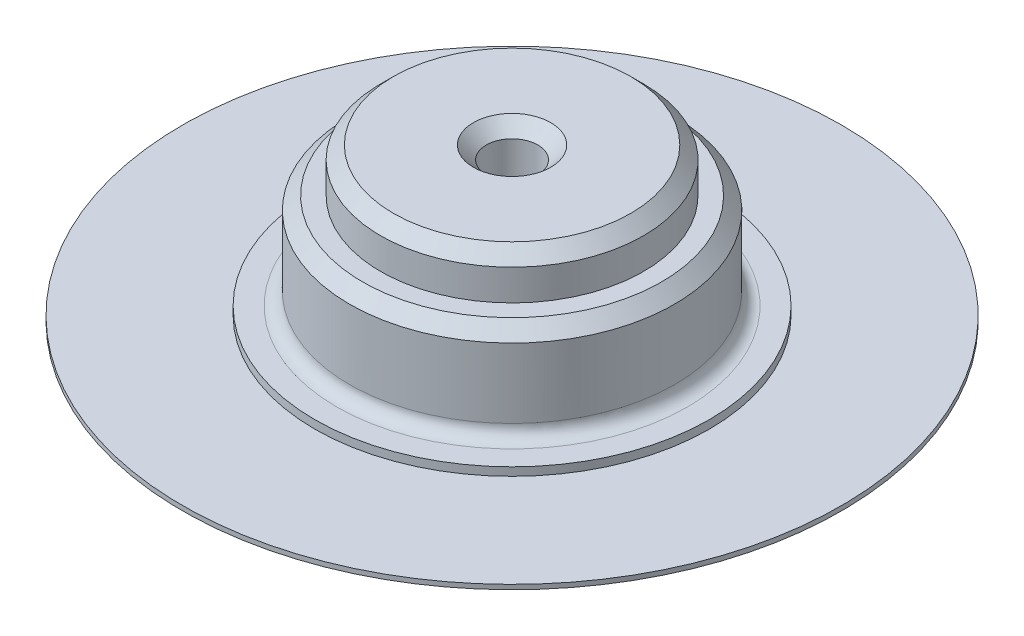
ISO-10303-21;
HEADER;
FILE_DESCRIPTION(('STEP AP214'),'2;1');
FILE_NAME('part.step','',(''),(''),'','','');
FILE_SCHEMA(('AUTOMOTIVE_DESIGN { 1 0 10303 214 1 1 1 1 }'));
ENDSEC;
DATA;
#1=APPLICATION_CONTEXT('core data for automotive mechanical design processes');
#2=APPLICATION_PROTOCOL_DEFINITION('international standard','automotive_design',2000,#1);
#3=PRODUCT_CONTEXT('',#1,'mechanical');
#4=PRODUCT('Part','Part','',(#3));
#5=PRODUCT_RELATED_PRODUCT_CATEGORY('part','',(#4));
#6=PRODUCT_DEFINITION_FORMATION('','',#4);
#7=PRODUCT_DEFINITION_CONTEXT('part definition',#1,'design');
#8=PRODUCT_DEFINITION('design','',#6,#7);
#9=PRODUCT_DEFINITION_SHAPE('','',#8);
#10=(LENGTH_UNIT() NAMED_UNIT(*) SI_UNIT(.MILLI.,.METRE.));
#11=(NAMED_UNIT(*) PLANE_ANGLE_UNIT() SI_UNIT($,.RADIAN.));
#12=(NAMED_UNIT(*) SI_UNIT($,.STERADIAN.) SOLID_ANGLE_UNIT());
#13=UNCERTAINTY_MEASURE_WITH_UNIT(LENGTH_MEASURE(1.E-05),#10,'distance_accuracy_value','');
#14=(GEOMETRIC_REPRESENTATION_CONTEXT(3) GLOBAL_UNCERTAINTY_ASSIGNED_CONTEXT((#13)) GLOBAL_UNIT_ASSIGNED_CONTEXT((#10,
#11,#12)) REPRESENTATION_CONTEXT('',''));
#15=CARTESIAN_POINT('',(0.,0.,0.));
#16=DIRECTION('',(0.,0.,1.));
#17=DIRECTION('',(1.,0.,0.));
#18=AXIS2_PLACEMENT_3D('',#15,#16,#17);
#19=CARTESIAN_POINT('',(0.,3.70000000003756,0.));
#20=DIRECTION('',(0.,-1.,0.));
#21=DIRECTION('',(0.,0.,-1.));
#22=AXIS2_PLACEMENT_3D('',#19,#20,#21);
#23=CONICAL_SURFACE('',#22,6.30000000006703,0.785398163454292);
#24=CARTESIAN_POINT('',(0.,3.7,0.));
#25=DIRECTION('',(0.,-1.,0.));
#26=DIRECTION('',(0.,0.,-1.));
#27=AXIS2_PLACEMENT_3D('',#24,#25,#26);
#28=CIRCLE('',#27,6.3);
#29=CARTESIAN_POINT('',(0.,3.7,-6.3));
#30=VERTEX_POINT('',#29);
#31=EDGE_CURVE('E91',#30,#30,#28,.T.);
#32=ORIENTED_EDGE('',*,*,#31,.F.);
#33=EDGE_LOOP('',(#32));
#34=FACE_BOUND('',#33,.T.);
#35=CARTESIAN_POINT('',(0.,4.20000000002574,0.));
#36=DIRECTION('',(0.,-1.,0.));
#37=DIRECTION('',(0.,0.,-1.));
#38=AXIS2_PLACEMENT_3D('',#35,#36,#37);
#39=CIRCLE('',#38,5.80000000002201);
#40=CARTESIAN_POINT('',(0.,4.20000000002574,-5.80000000002201));
#41=VERTEX_POINT('',#40);
#42=EDGE_CURVE('E90',#41,#41,#39,.F.);
#43=ORIENTED_EDGE('',*,*,#42,.F.);
#44=EDGE_LOOP('',(#43));
#45=FACE_BOUND('',#44,.T.);
#46=ADVANCED_FACE('F17',(#34,#45),#23,.T.);
#47=CARTESIAN_POINT('',(0.,0.,0.));
#48=DIRECTION('',(0.,-1.,0.));
#49=DIRECTION('',(0.,0.,-1.));
#50=AXIS2_PLACEMENT_3D('',#47,#48,#49);
#51=CYLINDRICAL_SURFACE('',#50,6.3);
#52=CARTESIAN_POINT('',(0.,1.,0.));
#53=DIRECTION('',(0.,-1.,0.));
#54=DIRECTION('',(1.,0.,0.));
#55=AXIS2_PLACEMENT_3D('',#52,#53,#54);
#56=CIRCLE('',#55,6.3);
#57=CARTESIAN_POINT('',(6.3,1.,0.));
#58=VERTEX_POINT('',#57);
#59=EDGE_CURVE('E82',#58,#58,#56,.F.);
#60=ORIENTED_EDGE('',*,*,#59,.T.);
#61=EDGE_LOOP('',(#60));
#62=FACE_BOUND('',#61,.T.);
#63=ORIENTED_EDGE('',*,*,#31,.T.);
#64=EDGE_LOOP('',(#63));
#65=FACE_BOUND('',#64,.T.);
#66=ADVANCED_FACE('F118',(#62,#65),#51,.T.);
#67=CARTESIAN_POINT('',(-5.8,4.2,0.));
#68=DIRECTION('',(0.,1.,0.));
#69=DIRECTION('',(0.,0.,1.));
#70=AXIS2_PLACEMENT_3D('',#67,#68,#69);
#71=PLANE('',#70);
#72=CARTESIAN_POINT('',(0.,4.2,0.));
#73=DIRECTION('',(0.,-1.,0.));
#74=DIRECTION('',(0.,0.,-1.));
#75=AXIS2_PLACEMENT_3D('',#72,#73,#74);
#76=CIRCLE('',#75,5.1);
#77=CARTESIAN_POINT('',(0.,4.2,-5.1));
#78=VERTEX_POINT('',#77);
#79=EDGE_CURVE('E41',#78,#78,#76,.F.);
#80=ORIENTED_EDGE('',*,*,#79,.F.);
#81=EDGE_LOOP('',(#80));
#82=FACE_BOUND('',#81,.T.);
#83=ORIENTED_EDGE('',*,*,#42,.T.);
#84=EDGE_LOOP('',(#83));
#85=FACE_BOUND('',#84,.T.);
#86=ADVANCED_FACE('F74',(#82,#85),#71,.T.);
#87=CARTESIAN_POINT('',(0.,1.,0.));
#88=DIRECTION('',(0.,-1.,0.));
#89=DIRECTION('',(1.,0.,0.));
#90=AXIS2_PLACEMENT_3D('',#87,#88,#89);
#91=TOROIDAL_SURFACE('',#90,6.8,0.5);
#92=ORIENTED_EDGE('',*,*,#59,.F.);
#93=EDGE_LOOP('',(#92));
#94=FACE_BOUND('',#93,.T.);
#95=CARTESIAN_POINT('',(0.,0.5,0.));
#96=DIRECTION('',(0.,1.,0.));
#97=DIRECTION('',(-1.,0.,0.));
#98=AXIS2_PLACEMENT_3D('',#95,#96,#97);
#99=CIRCLE('',#98,6.8);
#100=CARTESIAN_POINT('',(6.8,0.5,0.));
#101=VERTEX_POINT('',#100);
#102=CARTESIAN_POINT('',(-6.8,0.5,0.));
#103=VERTEX_POINT('',#102);
#104=EDGE_CURVE('E34',#101,#103,#99,.F.);
#105=ORIENTED_EDGE('',*,*,#104,.F.);
#106=CARTESIAN_POINT('',(0.,0.5,0.));
#107=DIRECTION('',(0.,1.,0.));
#108=DIRECTION('',(1.,0.,0.));
#109=AXIS2_PLACEMENT_3D('',#106,#107,#108);
#110=CIRCLE('',#109,6.8);
#111=EDGE_CURVE('E37',#103,#101,#110,.F.);
#112=ORIENTED_EDGE('',*,*,#111,.F.);
#113=EDGE_LOOP('',(#105,#112));
#114=FACE_BOUND('',#113,.T.);
#115=ADVANCED_FACE('F38',(#94,#114),#91,.F.);
#116=CARTESIAN_POINT('',(0.,0.,0.));
#117=DIRECTION('',(0.,-1.,0.));
#118=DIRECTION('',(0.,0.,-1.));
#119=AXIS2_PLACEMENT_3D('',#116,#117,#118);
#120=CYLINDRICAL_SURFACE('',#119,5.1);
#121=ORIENTED_EDGE('',*,*,#79,.T.);
#122=EDGE_LOOP('',(#121));
#123=FACE_BOUND('',#122,.T.);
#124=CARTESIAN_POINT('',(0.,5.40000000000873,0.));
#125=DIRECTION('',(0.,-1.,0.));
#126=DIRECTION('',(1.,0.,0.));
#127=AXIS2_PLACEMENT_3D('',#124,#125,#126);
#128=CIRCLE('',#127,5.10000000002719);
#129=CARTESIAN_POINT('',(5.10000000002719,5.40000000000873,0.));
#130=VERTEX_POINT('',#129);
#131=EDGE_CURVE('E46',#130,#130,#128,.F.);
#132=ORIENTED_EDGE('',*,*,#131,.F.);
#133=EDGE_LOOP('',(#132));
#134=FACE_BOUND('',#133,.T.);
#135=ADVANCED_FACE('F66',(#123,#134),#120,.T.);
#136=CARTESIAN_POINT('',(-7.65,0.5,0.));
#137=DIRECTION('',(0.,1.,0.));
#138=DIRECTION('',(0.,0.,1.));
#139=AXIS2_PLACEMENT_3D('',#136,#137,#138);
#140=PLANE('',#139);
#141=ORIENTED_EDGE('',*,*,#111,.T.);
#142=ORIENTED_EDGE('',*,*,#104,.T.);
#143=EDGE_LOOP('',(#141,#142));
#144=FACE_BOUND('',#143,.T.);
#145=CARTESIAN_POINT('',(0.,0.5,0.));
#146=DIRECTION('',(0.,-1.,0.));
#147=DIRECTION('',(0.,0.,-1.));
#148=AXIS2_PLACEMENT_3D('',#145,#146,#147);
#149=CIRCLE('',#148,7.65);
#150=CARTESIAN_POINT('',(0.,0.5,-7.65));
#151=VERTEX_POINT('',#150);
#152=EDGE_CURVE('E109',#151,#151,#149,.T.);
#153=ORIENTED_EDGE('',*,*,#152,.F.);
#154=EDGE_LOOP('',(#153));
#155=FACE_BOUND('',#154,.T.);
#156=ADVANCED_FACE('F44',(#144,#155),#140,.T.);
#157=CARTESIAN_POINT('',(0.,5.40000000000873,0.));
#158=DIRECTION('',(0.,-1.,0.));
#159=DIRECTION('',(0.,0.,-1.));
#160=AXIS2_PLACEMENT_3D('',#157,#158,#159);
#161=CONICAL_SURFACE('',#160,5.10000000002719,0.785398163454292);
#162=ORIENTED_EDGE('',*,*,#131,.T.);
#163=EDGE_LOOP('',(#162));
#164=FACE_BOUND('',#163,.T.);
#165=CARTESIAN_POINT('',(0.,5.89999999999691,0.));
#166=DIRECTION('',(0.,-1.,0.));
#167=DIRECTION('',(0.,0.,-1.));
#168=AXIS2_PLACEMENT_3D('',#165,#166,#167);
#169=CIRCLE('',#168,4.59999999998217);
#170=CARTESIAN_POINT('',(0.,5.89999999999691,-4.59999999998217));
#171=VERTEX_POINT('',#170);
#172=EDGE_CURVE('E106',#171,#171,#169,.F.);
#173=ORIENTED_EDGE('',*,*,#172,.F.);
#174=EDGE_LOOP('',(#173));
#175=FACE_BOUND('',#174,.T.);
#176=ADVANCED_FACE('F65',(#164,#175),#161,.T.);
#177=CARTESIAN_POINT('',(0.,0.,0.));
#178=DIRECTION('',(0.,-1.,0.));
#179=DIRECTION('',(0.,0.,-1.));
#180=AXIS2_PLACEMENT_3D('',#177,#178,#179);
#181=CYLINDRICAL_SURFACE('',#180,7.65);
#182=CARTESIAN_POINT('',(0.,0.18,0.));
#183=DIRECTION('',(0.,-1.,0.));
#184=DIRECTION('',(0.,0.,-1.));
#185=AXIS2_PLACEMENT_3D('',#182,#183,#184);
#186=CIRCLE('',#185,7.65);
#187=CARTESIAN_POINT('',(0.,0.18,-7.65));
#188=VERTEX_POINT('',#187);
#189=EDGE_CURVE('E103',#188,#188,#186,.T.);
#190=ORIENTED_EDGE('',*,*,#189,.F.);
#191=EDGE_LOOP('',(#190));
#192=FACE_BOUND('',#191,.T.);
#193=ORIENTED_EDGE('',*,*,#152,.T.);
#194=EDGE_LOOP('',(#193));
#195=FACE_BOUND('',#194,.T.);
#196=ADVANCED_FACE('F152',(#192,#195),#181,.T.);
#197=CARTESIAN_POINT('',(-4.6,5.9,0.));
#198=DIRECTION('',(0.,1.,0.));
#199=DIRECTION('',(0.,0.,1.));
#200=AXIS2_PLACEMENT_3D('',#197,#198,#199);
#201=PLANE('',#200);
#202=CARTESIAN_POINT('',(0.,5.90000000005375,0.));
#203=DIRECTION('',(0.,1.,0.));
#204=DIRECTION('',(0.,0.,1.));
#205=AXIS2_PLACEMENT_3D('',#202,#203,#204);
#206=CIRCLE('',#205,1.50000000002137);
#207=CARTESIAN_POINT('',(0.,5.90000000005375,1.50000000002137));
#208=VERTEX_POINT('',#207);
#209=EDGE_CURVE('E100',#208,#208,#206,.F.);
#210=ORIENTED_EDGE('',*,*,#209,.T.);
#211=EDGE_LOOP('',(#210));
#212=FACE_BOUND('',#211,.T.);
#213=ORIENTED_EDGE('',*,*,#172,.T.);
#214=EDGE_LOOP('',(#213));
#215=FACE_BOUND('',#214,.T.);
#216=ADVANCED_FACE('F149',(#212,#215),#201,.T.);
#217=CARTESIAN_POINT('',(-12.78,0.18,0.));
#218=DIRECTION('',(0.,1.,0.));
#219=DIRECTION('',(0.,0.,1.));
#220=AXIS2_PLACEMENT_3D('',#217,#218,#219);
#221=PLANE('',#220);
#222=ORIENTED_EDGE('',*,*,#189,.T.);
#223=EDGE_LOOP('',(#222));
#224=FACE_BOUND('',#223,.T.);
#225=CARTESIAN_POINT('',(0.,0.18,0.));
#226=DIRECTION('',(0.,-1.,0.));
#227=DIRECTION('',(0.,0.,-1.));
#228=AXIS2_PLACEMENT_3D('',#225,#226,#227);
#229=CIRCLE('',#228,12.78);
#230=CARTESIAN_POINT('',(0.,0.18,-12.78));
#231=VERTEX_POINT('',#230);
#232=EDGE_CURVE('E97',#231,#231,#229,.T.);
#233=ORIENTED_EDGE('',*,*,#232,.F.);
#234=EDGE_LOOP('',(#233));
#235=FACE_BOUND('',#234,.T.);
#236=ADVANCED_FACE('F145',(#224,#235),#221,.T.);
#237=CARTESIAN_POINT('',(0.,5.90000000005375,0.));
#238=DIRECTION('',(0.,1.,0.));
#239=DIRECTION('',(0.,0.,1.));
#240=AXIS2_PLACEMENT_3D('',#237,#238,#239);
#241=CONICAL_SURFACE('',#240,1.50000000002137,0.785398163454292);
#242=CARTESIAN_POINT('',(0.,5.4,0.));
#243=DIRECTION('',(0.,-1.,0.));
#244=DIRECTION('',(0.,0.,-1.));
#245=AXIS2_PLACEMENT_3D('',#242,#243,#244);
#246=CIRCLE('',#245,1.);
#247=CARTESIAN_POINT('',(0.,5.4,-1.));
#248=VERTEX_POINT('',#247);
#249=EDGE_CURVE('E96',#248,#248,#246,.T.);
#250=ORIENTED_EDGE('',*,*,#249,.T.);
#251=EDGE_LOOP('',(#250));
#252=FACE_BOUND('',#251,.T.);
#253=ORIENTED_EDGE('',*,*,#209,.F.);
#254=EDGE_LOOP('',(#253));
#255=FACE_BOUND('',#254,.T.);
#256=ADVANCED_FACE('F141',(#252,#255),#241,.F.);
#257=CARTESIAN_POINT('',(0.,0.,0.));
#258=DIRECTION('',(0.,-1.,0.));
#259=DIRECTION('',(0.,0.,-1.));
#260=AXIS2_PLACEMENT_3D('',#257,#258,#259);
#261=CYLINDRICAL_SURFACE('',#260,12.78);
#262=CARTESIAN_POINT('',(0.,0.,0.));
#263=DIRECTION('',(0.,-1.,0.));
#264=DIRECTION('',(0.,0.,-1.));
#265=AXIS2_PLACEMENT_3D('',#262,#263,#264);
#266=CIRCLE('',#265,12.78);
#267=CARTESIAN_POINT('',(0.,0.,-12.78));
#268=VERTEX_POINT('',#267);
#269=EDGE_CURVE('E28',#268,#268,#266,.T.);
#270=ORIENTED_EDGE('',*,*,#269,.F.);
#271=EDGE_LOOP('',(#270));
#272=FACE_BOUND('',#271,.T.);
#273=ORIENTED_EDGE('',*,*,#232,.T.);
#274=EDGE_LOOP('',(#273));
#275=FACE_BOUND('',#274,.T.);
#276=ADVANCED_FACE('F134',(#272,#275),#261,.T.);
#277=CARTESIAN_POINT('',(0.,5.9,0.));
#278=DIRECTION('',(0.,-1.,0.));
#279=DIRECTION('',(0.,0.,-1.));
#280=AXIS2_PLACEMENT_3D('',#277,#278,#279);
#281=CYLINDRICAL_SURFACE('',#280,1.);
#282=CARTESIAN_POINT('',(0.,0.,0.));
#283=DIRECTION('',(0.,-1.,0.));
#284=DIRECTION('',(0.,0.,-1.));
#285=AXIS2_PLACEMENT_3D('',#282,#283,#284);
#286=CIRCLE('',#285,1.);
#287=CARTESIAN_POINT('',(0.,0.,-1.));
#288=VERTEX_POINT('',#287);
#289=EDGE_CURVE('E11',#288,#288,#286,.F.);
#290=ORIENTED_EDGE('',*,*,#289,.F.);
#291=EDGE_LOOP('',(#290));
#292=FACE_BOUND('',#291,.T.);
#293=ORIENTED_EDGE('',*,*,#249,.F.);
#294=EDGE_LOOP('',(#293));
#295=FACE_BOUND('',#294,.T.);
#296=ADVANCED_FACE('F128',(#292,#295),#281,.F.);
#297=CARTESIAN_POINT('',(-1.5,0.,0.));
#298=DIRECTION('',(0.,-1.,0.));
#299=DIRECTION('',(0.,0.,-1.));
#300=AXIS2_PLACEMENT_3D('',#297,#298,#299);
#301=PLANE('',#300);
#302=ORIENTED_EDGE('',*,*,#289,.T.);
#303=EDGE_LOOP('',(#302));
#304=FACE_BOUND('',#303,.T.);
#305=ORIENTED_EDGE('',*,*,#269,.T.);
#306=EDGE_LOOP('',(#305));
#307=FACE_BOUND('',#306,.T.);
#308=ADVANCED_FACE('F126',(#304,#307),#301,.T.);
#309=CLOSED_SHELL('',(#46,#66,#86,#115,#135,#156,#176,#196,#216,#236,#256,#276,#296,#308));
#310=MANIFOLD_SOLID_BREP('B1',#309);
#311=ADVANCED_BREP_SHAPE_REPRESENTATION('',(#18,#310),#14);
#312=SHAPE_DEFINITION_REPRESENTATION(#9,#311);
ENDSEC;
END-ISO-10303-21;
